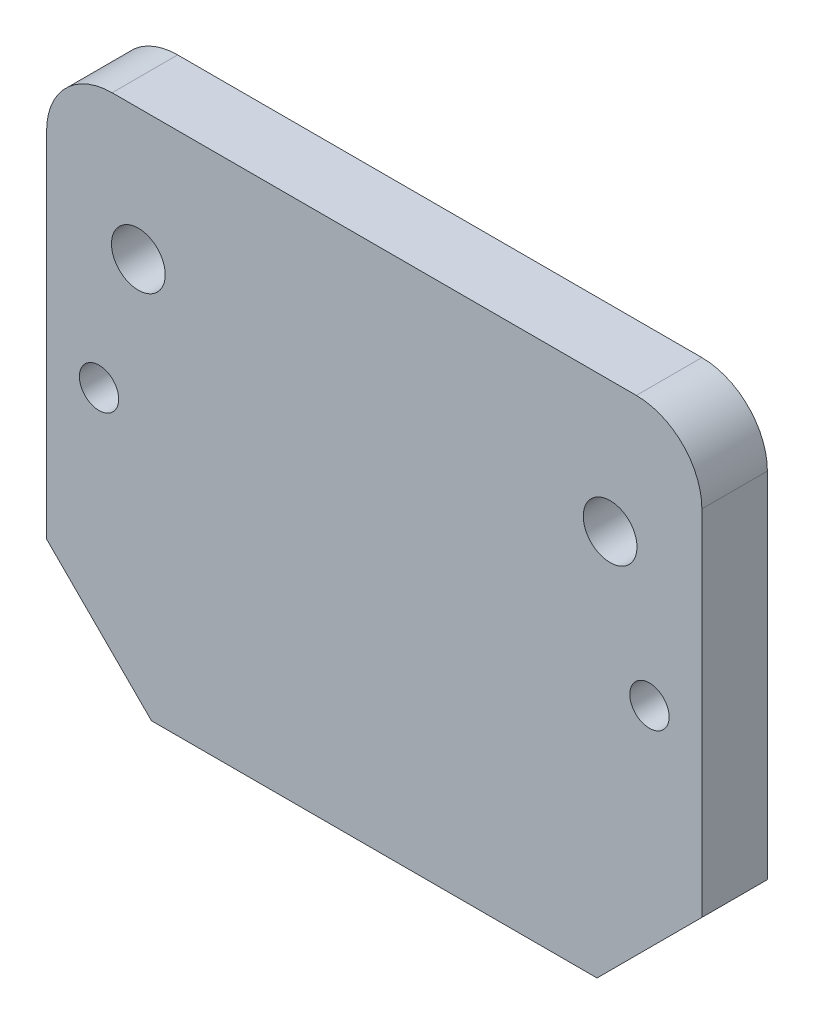
ISO-10303-21;
HEADER;
FILE_DESCRIPTION(('STEP AP214'),'2;1');
FILE_NAME('part.step','',(''),(''),'','','');
FILE_SCHEMA(('AUTOMOTIVE_DESIGN { 1 0 10303 214 1 1 1 1 }'));
ENDSEC;
DATA;
#1=APPLICATION_CONTEXT('core data for automotive mechanical design processes');
#2=APPLICATION_PROTOCOL_DEFINITION('international standard','automotive_design',2000,#1);
#3=PRODUCT_CONTEXT('',#1,'mechanical');
#4=PRODUCT('Part','Part','',(#3));
#5=PRODUCT_RELATED_PRODUCT_CATEGORY('part','',(#4));
#6=PRODUCT_DEFINITION_FORMATION('','',#4);
#7=PRODUCT_DEFINITION_CONTEXT('part definition',#1,'design');
#8=PRODUCT_DEFINITION('design','',#6,#7);
#9=PRODUCT_DEFINITION_SHAPE('','',#8);
#10=(LENGTH_UNIT() NAMED_UNIT(*) SI_UNIT(.MILLI.,.METRE.));
#11=(NAMED_UNIT(*) PLANE_ANGLE_UNIT() SI_UNIT($,.RADIAN.));
#12=(NAMED_UNIT(*) SI_UNIT($,.STERADIAN.) SOLID_ANGLE_UNIT());
#13=UNCERTAINTY_MEASURE_WITH_UNIT(LENGTH_MEASURE(1.E-05),#10,'distance_accuracy_value','');
#14=(GEOMETRIC_REPRESENTATION_CONTEXT(3) GLOBAL_UNCERTAINTY_ASSIGNED_CONTEXT((#13)) GLOBAL_UNIT_ASSIGNED_CONTEXT((#10,
#11,#12)) REPRESENTATION_CONTEXT('',''));
#15=CARTESIAN_POINT('',(0.,0.,0.));
#16=DIRECTION('',(0.,0.,1.));
#17=DIRECTION('',(1.,0.,0.));
#18=AXIS2_PLACEMENT_3D('',#15,#16,#17);
#19=CARTESIAN_POINT('',(0.,0.,5.));
#20=DIRECTION('',(0.,1.,0.));
#21=DIRECTION('',(0.,0.,1.));
#22=AXIS2_PLACEMENT_3D('',#19,#20,#21);
#23=PLANE('',#22);
#24=DIRECTION('',(1.,0.,0.));
#25=VECTOR('',#24,1.);
#26=CARTESIAN_POINT('',(0.,0.,0.));
#27=LINE('',#26,#25);
#28=CARTESIAN_POINT('',(0.,0.,0.));
#29=VERTEX_POINT('',#28);
#30=CARTESIAN_POINT('',(33.9999999999998,0.,0.));
#31=VERTEX_POINT('',#30);
#32=EDGE_CURVE('E122',#29,#31,#27,.T.);
#33=ORIENTED_EDGE('',*,*,#32,.T.);
#34=DIRECTION('',(0.,0.,-1.));
#35=VECTOR('',#34,1.);
#36=CARTESIAN_POINT('',(33.9999999999998,0.,5.));
#37=LINE('',#36,#35);
#38=CARTESIAN_POINT('',(33.9999999999998,0.,5.));
#39=VERTEX_POINT('',#38);
#40=EDGE_CURVE('E104',#39,#31,#37,.T.);
#41=ORIENTED_EDGE('',*,*,#40,.F.);
#42=DIRECTION('',(1.,0.,0.));
#43=VECTOR('',#42,1.);
#44=CARTESIAN_POINT('',(0.,0.,5.));
#45=LINE('',#44,#43);
#46=CARTESIAN_POINT('',(0.,0.,5.));
#47=VERTEX_POINT('',#46);
#48=EDGE_CURVE('E110',#47,#39,#45,.T.);
#49=ORIENTED_EDGE('',*,*,#48,.F.);
#50=DIRECTION('',(0.,0.,-1.));
#51=VECTOR('',#50,1.);
#52=CARTESIAN_POINT('',(0.,0.,5.));
#53=LINE('',#52,#51);
#54=EDGE_CURVE('E182',#47,#29,#53,.T.);
#55=ORIENTED_EDGE('',*,*,#54,.T.);
#56=EDGE_LOOP('',(#33,#41,#49,#55));
#57=FACE_BOUND('',#56,.T.);
#58=ADVANCED_FACE('F33',(#57),#23,.F.);
#59=CARTESIAN_POINT('',(33.9999999999998,0.,5.));
#60=DIRECTION('',(-0.707106781186544,0.707106781186552,0.));
#61=DIRECTION('',(-0.707106781186551,-0.707106781186544,0.));
#62=AXIS2_PLACEMENT_3D('',#59,#60,#61);
#63=PLANE('',#62);
#64=DIRECTION('',(0.707106781186552,0.707106781186544,0.));
#65=VECTOR('',#64,1.);
#66=CARTESIAN_POINT('',(33.9999999999998,0.,0.));
#67=LINE('',#66,#65);
#68=CARTESIAN_POINT('',(41.9999999999999,8.,0.));
#69=VERTEX_POINT('',#68);
#70=EDGE_CURVE('E177',#31,#69,#67,.T.);
#71=ORIENTED_EDGE('',*,*,#70,.T.);
#72=DIRECTION('',(0.,0.,-1.));
#73=VECTOR('',#72,1.);
#74=CARTESIAN_POINT('',(41.9999999999999,8.,5.));
#75=LINE('',#74,#73);
#76=CARTESIAN_POINT('',(41.9999999999999,8.,5.));
#77=VERTEX_POINT('',#76);
#78=EDGE_CURVE('E107',#77,#69,#75,.T.);
#79=ORIENTED_EDGE('',*,*,#78,.F.);
#80=DIRECTION('',(0.707106781186552,0.707106781186544,0.));
#81=VECTOR('',#80,1.);
#82=CARTESIAN_POINT('',(33.9999999999998,0.,5.));
#83=LINE('',#82,#81);
#84=EDGE_CURVE('E100',#39,#77,#83,.T.);
#85=ORIENTED_EDGE('',*,*,#84,.F.);
#86=ORIENTED_EDGE('',*,*,#40,.T.);
#87=EDGE_LOOP('',(#71,#79,#85,#86));
#88=FACE_BOUND('',#87,.T.);
#89=ADVANCED_FACE('F102',(#88),#63,.F.);
#90=CARTESIAN_POINT('',(41.9999999999999,8.,5.));
#91=DIRECTION('',(-1.,0.,0.));
#92=DIRECTION('',(0.,0.,1.));
#93=AXIS2_PLACEMENT_3D('',#90,#91,#92);
#94=PLANE('',#93);
#95=DIRECTION('',(0.,1.,0.));
#96=VECTOR('',#95,1.);
#97=CARTESIAN_POINT('',(41.9999999999999,8.,0.));
#98=LINE('',#97,#96);
#99=CARTESIAN_POINT('',(41.9999999999999,35.,0.));
#100=VERTEX_POINT('',#99);
#101=EDGE_CURVE('E174',#69,#100,#98,.T.);
#102=ORIENTED_EDGE('',*,*,#101,.T.);
#103=DIRECTION('',(0.,0.,-1.));
#104=VECTOR('',#103,1.);
#105=CARTESIAN_POINT('',(41.9999999999999,35.,5.));
#106=LINE('',#105,#104);
#107=CARTESIAN_POINT('',(41.9999999999999,35.,5.));
#108=VERTEX_POINT('',#107);
#109=EDGE_CURVE('E11',#100,#108,#106,.F.);
#110=ORIENTED_EDGE('',*,*,#109,.T.);
#111=DIRECTION('',(0.,1.,0.));
#112=VECTOR('',#111,1.);
#113=CARTESIAN_POINT('',(41.9999999999999,8.,5.));
#114=LINE('',#113,#112);
#115=EDGE_CURVE('E109',#77,#108,#114,.T.);
#116=ORIENTED_EDGE('',*,*,#115,.F.);
#117=ORIENTED_EDGE('',*,*,#78,.T.);
#118=EDGE_LOOP('',(#102,#110,#116,#117));
#119=FACE_BOUND('',#118,.T.);
#120=ADVANCED_FACE('F233',(#119),#94,.F.);
#121=CARTESIAN_POINT('',(-8.00000000000009,40.,5.));
#122=DIRECTION('',(0.,-1.,0.));
#123=DIRECTION('',(0.,0.,-1.));
#124=AXIS2_PLACEMENT_3D('',#121,#122,#123);
#125=PLANE('',#124);
#126=DIRECTION('',(-1.,0.,0.));
#127=VECTOR('',#126,1.);
#128=CARTESIAN_POINT('',(-8.00000000000009,40.,0.));
#129=LINE('',#128,#127);
#130=CARTESIAN_POINT('',(36.9999999999999,40.,0.));
#131=VERTEX_POINT('',#130);
#132=CARTESIAN_POINT('',(-3.00000000000009,40.,0.));
#133=VERTEX_POINT('',#132);
#134=EDGE_CURVE('E169',#131,#133,#129,.T.);
#135=ORIENTED_EDGE('',*,*,#134,.T.);
#136=DIRECTION('',(0.,0.,-1.));
#137=VECTOR('',#136,1.);
#138=CARTESIAN_POINT('',(-3.00000000000009,40.,5.));
#139=LINE('',#138,#137);
#140=CARTESIAN_POINT('',(-3.00000000000009,40.,5.));
#141=VERTEX_POINT('',#140);
#142=EDGE_CURVE('E54',#133,#141,#139,.F.);
#143=ORIENTED_EDGE('',*,*,#142,.T.);
#144=DIRECTION('',(-1.,0.,0.));
#145=VECTOR('',#144,1.);
#146=CARTESIAN_POINT('',(-8.00000000000009,40.,5.));
#147=LINE('',#146,#145);
#148=CARTESIAN_POINT('',(36.9999999999999,40.,5.));
#149=VERTEX_POINT('',#148);
#150=EDGE_CURVE('E157',#149,#141,#147,.T.);
#151=ORIENTED_EDGE('',*,*,#150,.F.);
#152=DIRECTION('',(0.,0.,-1.));
#153=VECTOR('',#152,1.);
#154=CARTESIAN_POINT('',(36.9999999999999,40.,5.));
#155=LINE('',#154,#153);
#156=EDGE_CURVE('E148',#149,#131,#155,.T.);
#157=ORIENTED_EDGE('',*,*,#156,.T.);
#158=EDGE_LOOP('',(#135,#143,#151,#157));
#159=FACE_BOUND('',#158,.T.);
#160=ADVANCED_FACE('F172',(#159),#125,.F.);
#161=CARTESIAN_POINT('',(-8.00000000000009,8.,5.));
#162=DIRECTION('',(1.,0.,0.));
#163=DIRECTION('',(0.,0.,-1.));
#164=AXIS2_PLACEMENT_3D('',#161,#162,#163);
#165=PLANE('',#164);
#166=DIRECTION('',(0.,-1.,0.));
#167=VECTOR('',#166,1.);
#168=CARTESIAN_POINT('',(-8.00000000000009,8.,5.));
#169=LINE('',#168,#167);
#170=CARTESIAN_POINT('',(-8.00000000000009,35.,5.));
#171=VERTEX_POINT('',#170);
#172=CARTESIAN_POINT('',(-8.00000000000009,8.,5.));
#173=VERTEX_POINT('',#172);
#174=EDGE_CURVE('E155',#171,#173,#169,.T.);
#175=ORIENTED_EDGE('',*,*,#174,.F.);
#176=DIRECTION('',(0.,0.,-1.));
#177=VECTOR('',#176,1.);
#178=CARTESIAN_POINT('',(-8.00000000000009,35.,5.));
#179=LINE('',#178,#177);
#180=CARTESIAN_POINT('',(-8.00000000000009,35.,0.));
#181=VERTEX_POINT('',#180);
#182=EDGE_CURVE('E123',#171,#181,#179,.T.);
#183=ORIENTED_EDGE('',*,*,#182,.T.);
#184=DIRECTION('',(0.,-1.,0.));
#185=VECTOR('',#184,1.);
#186=CARTESIAN_POINT('',(-8.00000000000009,8.,0.));
#187=LINE('',#186,#185);
#188=CARTESIAN_POINT('',(-8.00000000000009,8.,0.));
#189=VERTEX_POINT('',#188);
#190=EDGE_CURVE('E171',#181,#189,#187,.T.);
#191=ORIENTED_EDGE('',*,*,#190,.T.);
#192=DIRECTION('',(0.,0.,-1.));
#193=VECTOR('',#192,1.);
#194=CARTESIAN_POINT('',(-8.00000000000009,8.,5.));
#195=LINE('',#194,#193);
#196=EDGE_CURVE('E128',#173,#189,#195,.T.);
#197=ORIENTED_EDGE('',*,*,#196,.F.);
#198=EDGE_LOOP('',(#175,#183,#191,#197));
#199=FACE_BOUND('',#198,.T.);
#200=ADVANCED_FACE('F161',(#199),#165,.F.);
#201=CARTESIAN_POINT('',(0.,0.,5.));
#202=DIRECTION('',(0.707106781186544,0.707106781186551,0.));
#203=DIRECTION('',(-0.707106781186551,0.707106781186544,0.));
#204=AXIS2_PLACEMENT_3D('',#201,#202,#203);
#205=PLANE('',#204);
#206=DIRECTION('',(0.707106781186551,-0.707106781186544,0.));
#207=VECTOR('',#206,1.);
#208=CARTESIAN_POINT('',(0.,0.,0.));
#209=LINE('',#208,#207);
#210=EDGE_CURVE('E119',#189,#29,#209,.T.);
#211=ORIENTED_EDGE('',*,*,#210,.T.);
#212=ORIENTED_EDGE('',*,*,#54,.F.);
#213=DIRECTION('',(0.707106781186551,-0.707106781186544,0.));
#214=VECTOR('',#213,1.);
#215=CARTESIAN_POINT('',(0.,0.,5.));
#216=LINE('',#215,#214);
#217=EDGE_CURVE('E115',#173,#47,#216,.T.);
#218=ORIENTED_EDGE('',*,*,#217,.F.);
#219=ORIENTED_EDGE('',*,*,#196,.T.);
#220=EDGE_LOOP('',(#211,#212,#218,#219));
#221=FACE_BOUND('',#220,.T.);
#222=ADVANCED_FACE('F184',(#221),#205,.F.);
#223=CARTESIAN_POINT('',(0.,0.,5.));
#224=DIRECTION('',(0.,0.,1.));
#225=DIRECTION('',(1.,0.,0.));
#226=AXIS2_PLACEMENT_3D('',#223,#224,#225);
#227=PLANE('',#226);
#228=CARTESIAN_POINT('',(-1.00000000000008,30.,5.));
#229=DIRECTION('',(0.,0.,-1.));
#230=DIRECTION('',(1.,0.,0.));
#231=AXIS2_PLACEMENT_3D('',#228,#229,#230);
#232=CIRCLE('',#231,2.05);
#233=CARTESIAN_POINT('',(1.04999999999992,30.,5.));
#234=VERTEX_POINT('',#233);
#235=EDGE_CURVE('E194',#234,#234,#232,.T.);
#236=ORIENTED_EDGE('',*,*,#235,.T.);
#237=EDGE_LOOP('',(#236));
#238=FACE_BOUND('',#237,.T.);
#239=CARTESIAN_POINT('',(34.9999999999999,30.,5.));
#240=DIRECTION('',(0.,0.,-1.));
#241=DIRECTION('',(-1.,0.,0.));
#242=AXIS2_PLACEMENT_3D('',#239,#240,#241);
#243=CIRCLE('',#242,2.05);
#244=CARTESIAN_POINT('',(32.9499999999999,30.,5.));
#245=VERTEX_POINT('',#244);
#246=EDGE_CURVE('E197',#245,#245,#243,.T.);
#247=ORIENTED_EDGE('',*,*,#246,.T.);
#248=EDGE_LOOP('',(#247));
#249=FACE_BOUND('',#248,.T.);
#250=CARTESIAN_POINT('',(37.9999999999999,20.,5.));
#251=DIRECTION('',(0.,0.,-1.));
#252=DIRECTION('',(1.,0.,0.));
#253=AXIS2_PLACEMENT_3D('',#250,#251,#252);
#254=CIRCLE('',#253,1.5);
#255=CARTESIAN_POINT('',(39.4999999999999,20.,5.));
#256=VERTEX_POINT('',#255);
#257=EDGE_CURVE('E193',#256,#256,#254,.T.);
#258=ORIENTED_EDGE('',*,*,#257,.T.);
#259=EDGE_LOOP('',(#258));
#260=FACE_BOUND('',#259,.T.);
#261=CARTESIAN_POINT('',(-4.00000000000009,20.,5.));
#262=DIRECTION('',(0.,0.,-1.));
#263=DIRECTION('',(-1.,0.,0.));
#264=AXIS2_PLACEMENT_3D('',#261,#262,#263);
#265=CIRCLE('',#264,1.5);
#266=CARTESIAN_POINT('',(-5.50000000000009,20.,5.));
#267=VERTEX_POINT('',#266);
#268=EDGE_CURVE('E136',#267,#267,#265,.T.);
#269=ORIENTED_EDGE('',*,*,#268,.T.);
#270=EDGE_LOOP('',(#269));
#271=FACE_BOUND('',#270,.T.);
#272=ORIENTED_EDGE('',*,*,#150,.T.);
#273=CARTESIAN_POINT('',(-3.00000000000009,35.,5.));
#274=DIRECTION('',(0.,0.,1.));
#275=DIRECTION('',(1.,0.,0.));
#276=AXIS2_PLACEMENT_3D('',#273,#274,#275);
#277=CIRCLE('',#276,5.);
#278=EDGE_CURVE('E41',#141,#171,#277,.T.);
#279=ORIENTED_EDGE('',*,*,#278,.T.);
#280=ORIENTED_EDGE('',*,*,#174,.T.);
#281=ORIENTED_EDGE('',*,*,#217,.T.);
#282=ORIENTED_EDGE('',*,*,#48,.T.);
#283=ORIENTED_EDGE('',*,*,#84,.T.);
#284=ORIENTED_EDGE('',*,*,#115,.T.);
#285=CARTESIAN_POINT('',(36.9999999999999,35.,5.));
#286=DIRECTION('',(0.,0.,1.));
#287=DIRECTION('',(1.,0.,0.));
#288=AXIS2_PLACEMENT_3D('',#285,#286,#287);
#289=CIRCLE('',#288,5.);
#290=EDGE_CURVE('E152',#108,#149,#289,.T.);
#291=ORIENTED_EDGE('',*,*,#290,.T.);
#292=EDGE_LOOP('',(#272,#279,#280,#281,#282,#283,#284,#291));
#293=FACE_BOUND('',#292,.T.);
#294=ADVANCED_FACE('F113',(#238,#249,#260,#271,#293),#227,.T.);
#295=CARTESIAN_POINT('',(0.,0.,0.));
#296=DIRECTION('',(0.,0.,1.));
#297=DIRECTION('',(1.,0.,0.));
#298=AXIS2_PLACEMENT_3D('',#295,#296,#297);
#299=PLANE('',#298);
#300=CARTESIAN_POINT('',(-1.00000000000008,30.,0.));
#301=DIRECTION('',(0.,0.,1.));
#302=DIRECTION('',(1.,0.,0.));
#303=AXIS2_PLACEMENT_3D('',#300,#301,#302);
#304=CIRCLE('',#303,2.05);
#305=CARTESIAN_POINT('',(1.04999999999992,30.,0.));
#306=VERTEX_POINT('',#305);
#307=EDGE_CURVE('E142',#306,#306,#304,.T.);
#308=ORIENTED_EDGE('',*,*,#307,.T.);
#309=EDGE_LOOP('',(#308));
#310=FACE_BOUND('',#309,.T.);
#311=CARTESIAN_POINT('',(34.9999999999999,30.,0.));
#312=DIRECTION('',(0.,0.,1.));
#313=DIRECTION('',(1.,0.,0.));
#314=AXIS2_PLACEMENT_3D('',#311,#312,#313);
#315=CIRCLE('',#314,2.05);
#316=CARTESIAN_POINT('',(37.0499999999999,30.,0.));
#317=VERTEX_POINT('',#316);
#318=EDGE_CURVE('E139',#317,#317,#315,.T.);
#319=ORIENTED_EDGE('',*,*,#318,.T.);
#320=EDGE_LOOP('',(#319));
#321=FACE_BOUND('',#320,.T.);
#322=CARTESIAN_POINT('',(37.9999999999999,20.,0.));
#323=DIRECTION('',(0.,0.,1.));
#324=DIRECTION('',(1.,0.,0.));
#325=AXIS2_PLACEMENT_3D('',#322,#323,#324);
#326=CIRCLE('',#325,1.5);
#327=CARTESIAN_POINT('',(39.4999999999999,20.,0.));
#328=VERTEX_POINT('',#327);
#329=EDGE_CURVE('E135',#328,#328,#326,.T.);
#330=ORIENTED_EDGE('',*,*,#329,.T.);
#331=EDGE_LOOP('',(#330));
#332=FACE_BOUND('',#331,.T.);
#333=CARTESIAN_POINT('',(-4.00000000000009,20.,0.));
#334=DIRECTION('',(0.,0.,1.));
#335=DIRECTION('',(1.,0.,0.));
#336=AXIS2_PLACEMENT_3D('',#333,#334,#335);
#337=CIRCLE('',#336,1.5);
#338=CARTESIAN_POINT('',(-2.50000000000009,20.,0.));
#339=VERTEX_POINT('',#338);
#340=EDGE_CURVE('E132',#339,#339,#337,.T.);
#341=ORIENTED_EDGE('',*,*,#340,.T.);
#342=EDGE_LOOP('',(#341));
#343=FACE_BOUND('',#342,.T.);
#344=ORIENTED_EDGE('',*,*,#190,.F.);
#345=CARTESIAN_POINT('',(-3.00000000000009,35.,0.));
#346=DIRECTION('',(0.,0.,1.));
#347=DIRECTION('',(1.,0.,0.));
#348=AXIS2_PLACEMENT_3D('',#345,#346,#347);
#349=CIRCLE('',#348,5.);
#350=EDGE_CURVE('E146',#181,#133,#349,.F.);
#351=ORIENTED_EDGE('',*,*,#350,.T.);
#352=ORIENTED_EDGE('',*,*,#134,.F.);
#353=CARTESIAN_POINT('',(36.9999999999999,35.,0.));
#354=DIRECTION('',(0.,0.,1.));
#355=DIRECTION('',(1.,0.,0.));
#356=AXIS2_PLACEMENT_3D('',#353,#354,#355);
#357=CIRCLE('',#356,5.);
#358=EDGE_CURVE('E126',#131,#100,#357,.F.);
#359=ORIENTED_EDGE('',*,*,#358,.T.);
#360=ORIENTED_EDGE('',*,*,#101,.F.);
#361=ORIENTED_EDGE('',*,*,#70,.F.);
#362=ORIENTED_EDGE('',*,*,#32,.F.);
#363=ORIENTED_EDGE('',*,*,#210,.F.);
#364=EDGE_LOOP('',(#344,#351,#352,#359,#360,#361,#362,#363));
#365=FACE_BOUND('',#364,.T.);
#366=ADVANCED_FACE('F168',(#310,#321,#332,#343,#365),#299,.F.);
#367=CARTESIAN_POINT('',(-4.00000000000009,20.,5.));
#368=DIRECTION('',(0.,0.,-1.));
#369=DIRECTION('',(-1.,0.,0.));
#370=AXIS2_PLACEMENT_3D('',#367,#368,#369);
#371=CYLINDRICAL_SURFACE('',#370,1.5);
#372=ORIENTED_EDGE('',*,*,#268,.F.);
#373=EDGE_LOOP('',(#372));
#374=FACE_BOUND('',#373,.T.);
#375=ORIENTED_EDGE('',*,*,#340,.F.);
#376=EDGE_LOOP('',(#375));
#377=FACE_BOUND('',#376,.T.);
#378=ADVANCED_FACE('F209',(#374,#377),#371,.F.);
#379=CARTESIAN_POINT('',(37.9999999999999,20.,5.));
#380=DIRECTION('',(0.,0.,-1.));
#381=DIRECTION('',(-1.,0.,0.));
#382=AXIS2_PLACEMENT_3D('',#379,#380,#381);
#383=CYLINDRICAL_SURFACE('',#382,1.5);
#384=ORIENTED_EDGE('',*,*,#257,.F.);
#385=EDGE_LOOP('',(#384));
#386=FACE_BOUND('',#385,.T.);
#387=ORIENTED_EDGE('',*,*,#329,.F.);
#388=EDGE_LOOP('',(#387));
#389=FACE_BOUND('',#388,.T.);
#390=ADVANCED_FACE('F205',(#386,#389),#383,.F.);
#391=CARTESIAN_POINT('',(34.9999999999999,30.,5.));
#392=DIRECTION('',(0.,0.,-1.));
#393=DIRECTION('',(-1.,0.,0.));
#394=AXIS2_PLACEMENT_3D('',#391,#392,#393);
#395=CYLINDRICAL_SURFACE('',#394,2.05);
#396=ORIENTED_EDGE('',*,*,#246,.F.);
#397=EDGE_LOOP('',(#396));
#398=FACE_BOUND('',#397,.T.);
#399=ORIENTED_EDGE('',*,*,#318,.F.);
#400=EDGE_LOOP('',(#399));
#401=FACE_BOUND('',#400,.T.);
#402=ADVANCED_FACE('F208',(#398,#401),#395,.F.);
#403=CARTESIAN_POINT('',(-1.00000000000008,30.,5.));
#404=DIRECTION('',(0.,0.,-1.));
#405=DIRECTION('',(-1.,0.,0.));
#406=AXIS2_PLACEMENT_3D('',#403,#404,#405);
#407=CYLINDRICAL_SURFACE('',#406,2.05);
#408=ORIENTED_EDGE('',*,*,#235,.F.);
#409=EDGE_LOOP('',(#408));
#410=FACE_BOUND('',#409,.T.);
#411=ORIENTED_EDGE('',*,*,#307,.F.);
#412=EDGE_LOOP('',(#411));
#413=FACE_BOUND('',#412,.T.);
#414=ADVANCED_FACE('F237',(#410,#413),#407,.F.);
#415=CARTESIAN_POINT('',(-3.00000000000009,35.,5.));
#416=DIRECTION('',(0.,0.,-1.));
#417=DIRECTION('',(-1.,0.,0.));
#418=AXIS2_PLACEMENT_3D('',#415,#416,#417);
#419=CYLINDRICAL_SURFACE('',#418,5.);
#420=ORIENTED_EDGE('',*,*,#278,.F.);
#421=ORIENTED_EDGE('',*,*,#142,.F.);
#422=ORIENTED_EDGE('',*,*,#350,.F.);
#423=ORIENTED_EDGE('',*,*,#182,.F.);
#424=EDGE_LOOP('',(#420,#421,#422,#423));
#425=FACE_BOUND('',#424,.T.);
#426=ADVANCED_FACE('F165',(#425),#419,.T.);
#427=CARTESIAN_POINT('',(36.9999999999999,35.,5.));
#428=DIRECTION('',(0.,0.,-1.));
#429=DIRECTION('',(-1.,0.,0.));
#430=AXIS2_PLACEMENT_3D('',#427,#428,#429);
#431=CYLINDRICAL_SURFACE('',#430,5.);
#432=ORIENTED_EDGE('',*,*,#290,.F.);
#433=ORIENTED_EDGE('',*,*,#109,.F.);
#434=ORIENTED_EDGE('',*,*,#358,.F.);
#435=ORIENTED_EDGE('',*,*,#156,.F.);
#436=EDGE_LOOP('',(#432,#433,#434,#435));
#437=FACE_BOUND('',#436,.T.);
#438=ADVANCED_FACE('F35',(#437),#431,.T.);
#439=CLOSED_SHELL('',(#58,#89,#120,#160,#200,#222,#294,#366,#378,#390,#402,#414,#426,#438));
#440=MANIFOLD_SOLID_BREP('B2',#439);
#441=ADVANCED_BREP_SHAPE_REPRESENTATION('',(#18,#440),#14);
#442=SHAPE_DEFINITION_REPRESENTATION(#9,#441);
ENDSEC;
END-ISO-10303-21;
